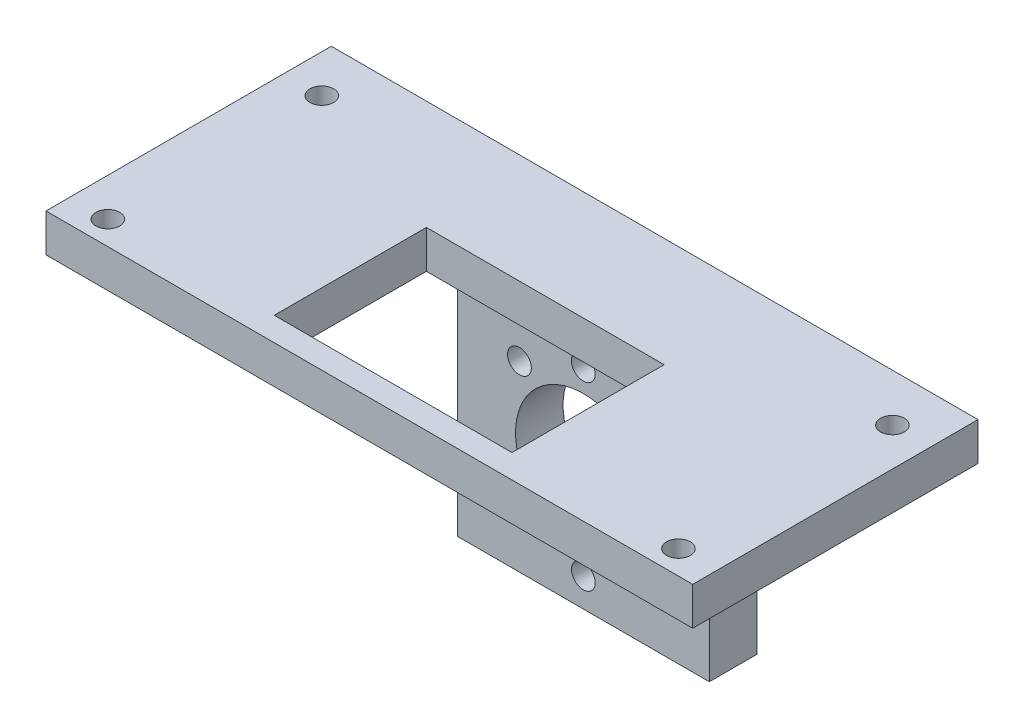
ISO-10303-21;
HEADER;
FILE_DESCRIPTION(('STEP AP214'),'2;1');
FILE_NAME('part.step','',(''),(''),'','','');
FILE_SCHEMA(('AUTOMOTIVE_DESIGN { 1 0 10303 214 1 1 1 1 }'));
ENDSEC;
DATA;
#1=APPLICATION_CONTEXT('core data for automotive mechanical design processes');
#2=APPLICATION_PROTOCOL_DEFINITION('international standard','automotive_design',2000,#1);
#3=PRODUCT_CONTEXT('',#1,'mechanical');
#4=PRODUCT('Part','Part','',(#3));
#5=PRODUCT_RELATED_PRODUCT_CATEGORY('part','',(#4));
#6=PRODUCT_DEFINITION_FORMATION('','',#4);
#7=PRODUCT_DEFINITION_CONTEXT('part definition',#1,'design');
#8=PRODUCT_DEFINITION('design','',#6,#7);
#9=PRODUCT_DEFINITION_SHAPE('','',#8);
#10=(LENGTH_UNIT() NAMED_UNIT(*) SI_UNIT(.MILLI.,.METRE.));
#11=(NAMED_UNIT(*) PLANE_ANGLE_UNIT() SI_UNIT($,.RADIAN.));
#12=(NAMED_UNIT(*) SI_UNIT($,.STERADIAN.) SOLID_ANGLE_UNIT());
#13=UNCERTAINTY_MEASURE_WITH_UNIT(LENGTH_MEASURE(1.E-05),#10,'distance_accuracy_value','');
#14=(GEOMETRIC_REPRESENTATION_CONTEXT(3) GLOBAL_UNCERTAINTY_ASSIGNED_CONTEXT((#13)) GLOBAL_UNIT_ASSIGNED_CONTEXT((#10,
#11,#12)) REPRESENTATION_CONTEXT('',''));
#15=CARTESIAN_POINT('',(0.,0.,0.));
#16=DIRECTION('',(0.,0.,1.));
#17=DIRECTION('',(1.,0.,0.));
#18=AXIS2_PLACEMENT_3D('',#15,#16,#17);
#19=CARTESIAN_POINT('',(54.564971157456,11.564971157456,5.));
#20=DIRECTION('',(0.,0.,1.));
#21=DIRECTION('',(1.,0.,0.));
#22=AXIS2_PLACEMENT_3D('',#19,#20,#21);
#23=CYLINDRICAL_SURFACE('',#22,2.5);
#24=CARTESIAN_POINT('',(54.564971157456,11.564971157456,5.));
#25=DIRECTION('',(0.,0.,1.));
#26=DIRECTION('',(1.,0.,0.));
#27=AXIS2_PLACEMENT_3D('',#24,#25,#26);
#28=CIRCLE('',#27,2.5);
#29=CARTESIAN_POINT('',(57.064971157456,11.564971157456,5.));
#30=VERTEX_POINT('',#29);
#31=EDGE_CURVE('E175',#30,#30,#28,.F.);
#32=ORIENTED_EDGE('',*,*,#31,.T.);
#33=EDGE_LOOP('',(#32));
#34=FACE_BOUND('',#33,.T.);
#35=CARTESIAN_POINT('',(54.564971157456,11.564971157456,15.));
#36=DIRECTION('',(0.,0.,1.));
#37=DIRECTION('',(1.,0.,0.));
#38=AXIS2_PLACEMENT_3D('',#35,#36,#37);
#39=CIRCLE('',#38,2.5);
#40=CARTESIAN_POINT('',(57.064971157456,11.564971157456,15.));
#41=VERTEX_POINT('',#40);
#42=EDGE_CURVE('E19',#41,#41,#39,.F.);
#43=ORIENTED_EDGE('',*,*,#42,.F.);
#44=EDGE_LOOP('',(#43));
#45=FACE_BOUND('',#44,.T.);
#46=ADVANCED_FACE('F16',(#34,#45),#23,.F.);
#47=CARTESIAN_POINT('',(68.,6.,5.));
#48=DIRECTION('',(0.,0.,1.));
#49=DIRECTION('',(1.,0.,0.));
#50=AXIS2_PLACEMENT_3D('',#47,#48,#49);
#51=CYLINDRICAL_SURFACE('',#50,2.5);
#52=CARTESIAN_POINT('',(68.,6.,5.));
#53=DIRECTION('',(0.,0.,1.));
#54=DIRECTION('',(1.,0.,0.));
#55=AXIS2_PLACEMENT_3D('',#52,#53,#54);
#56=CIRCLE('',#55,2.5);
#57=CARTESIAN_POINT('',(70.5,6.,5.));
#58=VERTEX_POINT('',#57);
#59=EDGE_CURVE('E229',#58,#58,#56,.F.);
#60=ORIENTED_EDGE('',*,*,#59,.T.);
#61=EDGE_LOOP('',(#60));
#62=FACE_BOUND('',#61,.T.);
#63=CARTESIAN_POINT('',(68.,6.,15.));
#64=DIRECTION('',(0.,0.,1.));
#65=DIRECTION('',(1.,0.,0.));
#66=AXIS2_PLACEMENT_3D('',#63,#64,#65);
#67=CIRCLE('',#66,2.5);
#68=CARTESIAN_POINT('',(70.5,6.,15.));
#69=VERTEX_POINT('',#68);
#70=EDGE_CURVE('E247',#69,#69,#67,.F.);
#71=ORIENTED_EDGE('',*,*,#70,.F.);
#72=EDGE_LOOP('',(#71));
#73=FACE_BOUND('',#72,.T.);
#74=ADVANCED_FACE('F258',(#62,#73),#51,.F.);
#75=CARTESIAN_POINT('',(81.435028842544,11.564971157456,5.));
#76=DIRECTION('',(0.,0.,1.));
#77=DIRECTION('',(1.,0.,0.));
#78=AXIS2_PLACEMENT_3D('',#75,#76,#77);
#79=CYLINDRICAL_SURFACE('',#78,2.5);
#80=CARTESIAN_POINT('',(81.435028842544,11.564971157456,5.));
#81=DIRECTION('',(0.,0.,1.));
#82=DIRECTION('',(1.,0.,0.));
#83=AXIS2_PLACEMENT_3D('',#80,#81,#82);
#84=CIRCLE('',#83,2.5);
#85=CARTESIAN_POINT('',(83.935028842544,11.564971157456,5.));
#86=VERTEX_POINT('',#85);
#87=EDGE_CURVE('E226',#86,#86,#84,.F.);
#88=ORIENTED_EDGE('',*,*,#87,.T.);
#89=EDGE_LOOP('',(#88));
#90=FACE_BOUND('',#89,.T.);
#91=CARTESIAN_POINT('',(81.435028842544,11.564971157456,15.));
#92=DIRECTION('',(0.,0.,1.));
#93=DIRECTION('',(1.,0.,0.));
#94=AXIS2_PLACEMENT_3D('',#91,#92,#93);
#95=CIRCLE('',#94,2.5);
#96=CARTESIAN_POINT('',(83.935028842544,11.564971157456,15.));
#97=VERTEX_POINT('',#96);
#98=EDGE_CURVE('E245',#97,#97,#95,.F.);
#99=ORIENTED_EDGE('',*,*,#98,.F.);
#100=EDGE_LOOP('',(#99));
#101=FACE_BOUND('',#100,.T.);
#102=ADVANCED_FACE('F264',(#90,#101),#79,.F.);
#103=CARTESIAN_POINT('',(68.,25.,5.));
#104=DIRECTION('',(0.,0.,1.));
#105=DIRECTION('',(1.,0.,0.));
#106=AXIS2_PLACEMENT_3D('',#103,#104,#105);
#107=CYLINDRICAL_SURFACE('',#106,14.25);
#108=CARTESIAN_POINT('',(68.,25.,5.));
#109=DIRECTION('',(0.,0.,1.));
#110=DIRECTION('',(1.,0.,0.));
#111=AXIS2_PLACEMENT_3D('',#108,#109,#110);
#112=CIRCLE('',#111,14.25);
#113=CARTESIAN_POINT('',(82.25,25.,5.));
#114=VERTEX_POINT('',#113);
#115=EDGE_CURVE('E223',#114,#114,#112,.F.);
#116=ORIENTED_EDGE('',*,*,#115,.T.);
#117=EDGE_LOOP('',(#116));
#118=FACE_BOUND('',#117,.T.);
#119=CARTESIAN_POINT('',(68.,25.,15.));
#120=DIRECTION('',(0.,0.,1.));
#121=DIRECTION('',(1.,0.,0.));
#122=AXIS2_PLACEMENT_3D('',#119,#120,#121);
#123=CIRCLE('',#122,14.25);
#124=CARTESIAN_POINT('',(82.25,25.,15.));
#125=VERTEX_POINT('',#124);
#126=EDGE_CURVE('E242',#125,#125,#123,.F.);
#127=ORIENTED_EDGE('',*,*,#126,.F.);
#128=EDGE_LOOP('',(#127));
#129=FACE_BOUND('',#128,.T.);
#130=ADVANCED_FACE('F354',(#118,#129),#107,.F.);
#131=CARTESIAN_POINT('',(54.564971157456,38.435028842544,5.));
#132=DIRECTION('',(0.,0.,1.));
#133=DIRECTION('',(1.,0.,0.));
#134=AXIS2_PLACEMENT_3D('',#131,#132,#133);
#135=CYLINDRICAL_SURFACE('',#134,2.5);
#136=CARTESIAN_POINT('',(54.564971157456,38.435028842544,5.));
#137=DIRECTION('',(0.,0.,1.));
#138=DIRECTION('',(1.,0.,0.));
#139=AXIS2_PLACEMENT_3D('',#136,#137,#138);
#140=CIRCLE('',#139,2.5);
#141=CARTESIAN_POINT('',(57.064971157456,38.435028842544,5.));
#142=VERTEX_POINT('',#141);
#143=EDGE_CURVE('E220',#142,#142,#140,.F.);
#144=ORIENTED_EDGE('',*,*,#143,.T.);
#145=EDGE_LOOP('',(#144));
#146=FACE_BOUND('',#145,.T.);
#147=CARTESIAN_POINT('',(54.564971157456,38.435028842544,15.));
#148=DIRECTION('',(0.,0.,1.));
#149=DIRECTION('',(1.,0.,0.));
#150=AXIS2_PLACEMENT_3D('',#147,#148,#149);
#151=CIRCLE('',#150,2.5);
#152=CARTESIAN_POINT('',(57.064971157456,38.435028842544,15.));
#153=VERTEX_POINT('',#152);
#154=EDGE_CURVE('E239',#153,#153,#151,.F.);
#155=ORIENTED_EDGE('',*,*,#154,.F.);
#156=EDGE_LOOP('',(#155));
#157=FACE_BOUND('',#156,.T.);
#158=ADVANCED_FACE('F350',(#146,#157),#135,.F.);
#159=CARTESIAN_POINT('',(68.,44.,5.));
#160=DIRECTION('',(0.,0.,1.));
#161=DIRECTION('',(1.,0.,0.));
#162=AXIS2_PLACEMENT_3D('',#159,#160,#161);
#163=CYLINDRICAL_SURFACE('',#162,2.5);
#164=CARTESIAN_POINT('',(68.,44.,5.));
#165=DIRECTION('',(0.,0.,1.));
#166=DIRECTION('',(1.,0.,0.));
#167=AXIS2_PLACEMENT_3D('',#164,#165,#166);
#168=CIRCLE('',#167,2.5);
#169=CARTESIAN_POINT('',(70.5,44.,5.));
#170=VERTEX_POINT('',#169);
#171=EDGE_CURVE('E217',#170,#170,#168,.F.);
#172=ORIENTED_EDGE('',*,*,#171,.T.);
#173=EDGE_LOOP('',(#172));
#174=FACE_BOUND('',#173,.T.);
#175=CARTESIAN_POINT('',(68.,44.,15.));
#176=DIRECTION('',(0.,0.,1.));
#177=DIRECTION('',(1.,0.,0.));
#178=AXIS2_PLACEMENT_3D('',#175,#176,#177);
#179=CIRCLE('',#178,2.5);
#180=CARTESIAN_POINT('',(70.5,44.,15.));
#181=VERTEX_POINT('',#180);
#182=EDGE_CURVE('E236',#181,#181,#179,.F.);
#183=ORIENTED_EDGE('',*,*,#182,.F.);
#184=EDGE_LOOP('',(#183));
#185=FACE_BOUND('',#184,.T.);
#186=ADVANCED_FACE('F346',(#174,#185),#163,.F.);
#187=CARTESIAN_POINT('',(81.435028842544,38.435028842544,5.));
#188=DIRECTION('',(0.,0.,1.));
#189=DIRECTION('',(1.,0.,0.));
#190=AXIS2_PLACEMENT_3D('',#187,#188,#189);
#191=CYLINDRICAL_SURFACE('',#190,2.5);
#192=CARTESIAN_POINT('',(81.435028842544,38.435028842544,5.));
#193=DIRECTION('',(0.,0.,1.));
#194=DIRECTION('',(1.,0.,0.));
#195=AXIS2_PLACEMENT_3D('',#192,#193,#194);
#196=CIRCLE('',#195,2.5);
#197=CARTESIAN_POINT('',(83.935028842544,38.435028842544,5.));
#198=VERTEX_POINT('',#197);
#199=EDGE_CURVE('E171',#198,#198,#196,.F.);
#200=ORIENTED_EDGE('',*,*,#199,.T.);
#201=EDGE_LOOP('',(#200));
#202=FACE_BOUND('',#201,.T.);
#203=CARTESIAN_POINT('',(81.435028842544,38.435028842544,15.));
#204=DIRECTION('',(0.,0.,1.));
#205=DIRECTION('',(1.,0.,0.));
#206=AXIS2_PLACEMENT_3D('',#203,#204,#205);
#207=CIRCLE('',#206,2.5);
#208=CARTESIAN_POINT('',(83.935028842544,38.435028842544,15.));
#209=VERTEX_POINT('',#208);
#210=EDGE_CURVE('E180',#209,#209,#207,.F.);
#211=ORIENTED_EDGE('',*,*,#210,.F.);
#212=EDGE_LOOP('',(#211));
#213=FACE_BOUND('',#212,.T.);
#214=ADVANCED_FACE('F342',(#202,#213),#191,.F.);
#215=CARTESIAN_POINT('',(41.5,0.,5.));
#216=DIRECTION('',(0.,1.,0.));
#217=DIRECTION('',(0.,0.,1.));
#218=AXIS2_PLACEMENT_3D('',#215,#216,#217);
#219=PLANE('',#218);
#220=DIRECTION('',(1.,0.,0.));
#221=VECTOR('',#220,1.);
#222=CARTESIAN_POINT('',(41.5,0.,15.));
#223=LINE('',#222,#221);
#224=CARTESIAN_POINT('',(41.5,0.,15.));
#225=VERTEX_POINT('',#224);
#226=CARTESIAN_POINT('',(94.5,0.,15.));
#227=VERTEX_POINT('',#226);
#228=EDGE_CURVE('E165',#225,#227,#223,.T.);
#229=ORIENTED_EDGE('',*,*,#228,.F.);
#230=DIRECTION('',(0.,0.,-1.));
#231=VECTOR('',#230,1.);
#232=CARTESIAN_POINT('',(41.5,0.,5.));
#233=LINE('',#232,#231);
#234=CARTESIAN_POINT('',(41.5,0.,5.));
#235=VERTEX_POINT('',#234);
#236=EDGE_CURVE('E178',#225,#235,#233,.T.);
#237=ORIENTED_EDGE('',*,*,#236,.T.);
#238=DIRECTION('',(1.,0.,0.));
#239=VECTOR('',#238,1.);
#240=CARTESIAN_POINT('',(41.5,0.,5.));
#241=LINE('',#240,#239);
#242=CARTESIAN_POINT('',(94.5,0.,5.));
#243=VERTEX_POINT('',#242);
#244=EDGE_CURVE('E153',#235,#243,#241,.T.);
#245=ORIENTED_EDGE('',*,*,#244,.T.);
#246=DIRECTION('',(0.,0.,-1.));
#247=VECTOR('',#246,1.);
#248=CARTESIAN_POINT('',(94.5,0.,5.));
#249=LINE('',#248,#247);
#250=EDGE_CURVE('E144',#227,#243,#249,.T.);
#251=ORIENTED_EDGE('',*,*,#250,.F.);
#252=EDGE_LOOP('',(#229,#237,#245,#251));
#253=FACE_BOUND('',#252,.T.);
#254=ADVANCED_FACE('F338',(#253),#219,.F.);
#255=CARTESIAN_POINT('',(41.5,0.,15.));
#256=DIRECTION('',(0.,0.,1.));
#257=DIRECTION('',(1.,0.,0.));
#258=AXIS2_PLACEMENT_3D('',#255,#256,#257);
#259=PLANE('',#258);
#260=ORIENTED_EDGE('',*,*,#210,.T.);
#261=EDGE_LOOP('',(#260));
#262=FACE_BOUND('',#261,.T.);
#263=ORIENTED_EDGE('',*,*,#182,.T.);
#264=EDGE_LOOP('',(#263));
#265=FACE_BOUND('',#264,.T.);
#266=ORIENTED_EDGE('',*,*,#154,.T.);
#267=EDGE_LOOP('',(#266));
#268=FACE_BOUND('',#267,.T.);
#269=ORIENTED_EDGE('',*,*,#126,.T.);
#270=EDGE_LOOP('',(#269));
#271=FACE_BOUND('',#270,.T.);
#272=ORIENTED_EDGE('',*,*,#98,.T.);
#273=EDGE_LOOP('',(#272));
#274=FACE_BOUND('',#273,.T.);
#275=ORIENTED_EDGE('',*,*,#70,.T.);
#276=EDGE_LOOP('',(#275));
#277=FACE_BOUND('',#276,.T.);
#278=ORIENTED_EDGE('',*,*,#42,.T.);
#279=EDGE_LOOP('',(#278));
#280=FACE_BOUND('',#279,.T.);
#281=DIRECTION('',(0.,1.,0.));
#282=VECTOR('',#281,1.);
#283=CARTESIAN_POINT('',(94.5,0.,15.));
#284=LINE('',#283,#282);
#285=CARTESIAN_POINT('',(94.5,50.,15.));
#286=VERTEX_POINT('',#285);
#287=EDGE_CURVE('E130',#286,#227,#284,.F.);
#288=ORIENTED_EDGE('',*,*,#287,.F.);
#289=DIRECTION('',(1.,0.,0.));
#290=VECTOR('',#289,1.);
#291=CARTESIAN_POINT('',(41.5,50.,15.));
#292=LINE('',#291,#290);
#293=CARTESIAN_POINT('',(41.5,50.,15.));
#294=VERTEX_POINT('',#293);
#295=EDGE_CURVE('E129',#286,#294,#292,.F.);
#296=ORIENTED_EDGE('',*,*,#295,.T.);
#297=DIRECTION('',(0.,1.,0.));
#298=VECTOR('',#297,1.);
#299=CARTESIAN_POINT('',(41.5,0.,15.));
#300=LINE('',#299,#298);
#301=EDGE_CURVE('E154',#294,#225,#300,.F.);
#302=ORIENTED_EDGE('',*,*,#301,.T.);
#303=ORIENTED_EDGE('',*,*,#228,.T.);
#304=EDGE_LOOP('',(#288,#296,#302,#303));
#305=FACE_BOUND('',#304,.T.);
#306=ADVANCED_FACE('F254',(#262,#265,#268,#271,#274,#277,#280,#305),#259,.T.);
#307=CARTESIAN_POINT('',(41.5,0.,5.));
#308=DIRECTION('',(1.,0.,0.));
#309=DIRECTION('',(0.,0.,-1.));
#310=AXIS2_PLACEMENT_3D('',#307,#308,#309);
#311=PLANE('',#310);
#312=ORIENTED_EDGE('',*,*,#301,.F.);
#313=CARTESIAN_POINT('',(41.5,50.,18.));
#314=DIRECTION('',(1.,0.,0.));
#315=DIRECTION('',(0.,0.,-1.));
#316=AXIS2_PLACEMENT_3D('',#313,#314,#315);
#317=CIRCLE('',#316,3.);
#318=CARTESIAN_POINT('',(41.5,53.,18.));
#319=VERTEX_POINT('',#318);
#320=EDGE_CURVE('E158',#294,#319,#317,.T.);
#321=ORIENTED_EDGE('',*,*,#320,.T.);
#322=DIRECTION('',(0.,0.,1.));
#323=VECTOR('',#322,1.);
#324=CARTESIAN_POINT('',(41.5,53.,0.));
#325=LINE('',#324,#323);
#326=CARTESIAN_POINT('',(41.5,53.,5.));
#327=VERTEX_POINT('',#326);
#328=EDGE_CURVE('E134',#319,#327,#325,.F.);
#329=ORIENTED_EDGE('',*,*,#328,.T.);
#330=DIRECTION('',(0.,1.,0.));
#331=VECTOR('',#330,1.);
#332=CARTESIAN_POINT('',(41.5,0.,5.));
#333=LINE('',#332,#331);
#334=EDGE_CURVE('E150',#327,#235,#333,.F.);
#335=ORIENTED_EDGE('',*,*,#334,.T.);
#336=ORIENTED_EDGE('',*,*,#236,.F.);
#337=EDGE_LOOP('',(#312,#321,#329,#335,#336));
#338=FACE_BOUND('',#337,.T.);
#339=ADVANCED_FACE('F331',(#338),#311,.F.);
#340=CARTESIAN_POINT('',(41.5,0.,5.));
#341=DIRECTION('',(0.,0.,1.));
#342=DIRECTION('',(1.,0.,0.));
#343=AXIS2_PLACEMENT_3D('',#340,#341,#342);
#344=PLANE('',#343);
#345=ORIENTED_EDGE('',*,*,#199,.F.);
#346=EDGE_LOOP('',(#345));
#347=FACE_BOUND('',#346,.T.);
#348=ORIENTED_EDGE('',*,*,#171,.F.);
#349=EDGE_LOOP('',(#348));
#350=FACE_BOUND('',#349,.T.);
#351=ORIENTED_EDGE('',*,*,#143,.F.);
#352=EDGE_LOOP('',(#351));
#353=FACE_BOUND('',#352,.T.);
#354=ORIENTED_EDGE('',*,*,#115,.F.);
#355=EDGE_LOOP('',(#354));
#356=FACE_BOUND('',#355,.T.);
#357=ORIENTED_EDGE('',*,*,#87,.F.);
#358=EDGE_LOOP('',(#357));
#359=FACE_BOUND('',#358,.T.);
#360=ORIENTED_EDGE('',*,*,#59,.F.);
#361=EDGE_LOOP('',(#360));
#362=FACE_BOUND('',#361,.T.);
#363=ORIENTED_EDGE('',*,*,#31,.F.);
#364=EDGE_LOOP('',(#363));
#365=FACE_BOUND('',#364,.T.);
#366=DIRECTION('',(0.,1.,0.));
#367=VECTOR('',#366,1.);
#368=CARTESIAN_POINT('',(94.5,0.,5.));
#369=LINE('',#368,#367);
#370=CARTESIAN_POINT('',(94.5,53.,5.));
#371=VERTEX_POINT('',#370);
#372=EDGE_CURVE('E117',#243,#371,#369,.T.);
#373=ORIENTED_EDGE('',*,*,#372,.F.);
#374=ORIENTED_EDGE('',*,*,#244,.F.);
#375=ORIENTED_EDGE('',*,*,#334,.F.);
#376=DIRECTION('',(1.,0.,0.));
#377=VECTOR('',#376,1.);
#378=CARTESIAN_POINT('',(0.,53.,5.));
#379=LINE('',#378,#377);
#380=EDGE_CURVE('E123',#327,#371,#379,.T.);
#381=ORIENTED_EDGE('',*,*,#380,.T.);
#382=EDGE_LOOP('',(#373,#374,#375,#381));
#383=FACE_BOUND('',#382,.T.);
#384=ADVANCED_FACE('F328',(#347,#350,#353,#356,#359,#362,#365,#383),#344,.F.);
#385=CARTESIAN_POINT('',(94.5,50.,15.));
#386=DIRECTION('',(1.,0.,0.));
#387=DIRECTION('',(0.,0.,-1.));
#388=AXIS2_PLACEMENT_3D('',#385,#386,#387);
#389=PLANE('',#388);
#390=CARTESIAN_POINT('',(94.5,50.,18.));
#391=DIRECTION('',(1.,0.,0.));
#392=DIRECTION('',(0.,0.,-1.));
#393=AXIS2_PLACEMENT_3D('',#390,#391,#392);
#394=CIRCLE('',#393,3.);
#395=CARTESIAN_POINT('',(94.5,53.,18.));
#396=VERTEX_POINT('',#395);
#397=EDGE_CURVE('E113',#396,#286,#394,.F.);
#398=ORIENTED_EDGE('',*,*,#397,.T.);
#399=ORIENTED_EDGE('',*,*,#287,.T.);
#400=ORIENTED_EDGE('',*,*,#250,.T.);
#401=ORIENTED_EDGE('',*,*,#372,.T.);
#402=DIRECTION('',(0.,0.,1.));
#403=VECTOR('',#402,1.);
#404=CARTESIAN_POINT('',(94.5,53.,0.));
#405=LINE('',#404,#403);
#406=EDGE_CURVE('E109',#371,#396,#405,.T.);
#407=ORIENTED_EDGE('',*,*,#406,.T.);
#408=EDGE_LOOP('',(#398,#399,#400,#401,#407));
#409=FACE_BOUND('',#408,.T.);
#410=ADVANCED_FACE('F111',(#409),#389,.T.);
#411=CARTESIAN_POINT('',(41.5,50.,18.));
#412=DIRECTION('',(1.,0.,0.));
#413=DIRECTION('',(0.,0.,-1.));
#414=AXIS2_PLACEMENT_3D('',#411,#412,#413);
#415=CYLINDRICAL_SURFACE('',#414,3.);
#416=ORIENTED_EDGE('',*,*,#320,.F.);
#417=ORIENTED_EDGE('',*,*,#295,.F.);
#418=ORIENTED_EDGE('',*,*,#397,.F.);
#419=DIRECTION('',(1.,0.,0.));
#420=VECTOR('',#419,1.);
#421=CARTESIAN_POINT('',(0.,53.,18.));
#422=LINE('',#421,#420);
#423=EDGE_CURVE('E122',#396,#319,#422,.F.);
#424=ORIENTED_EDGE('',*,*,#423,.T.);
#425=EDGE_LOOP('',(#416,#417,#418,#424));
#426=FACE_BOUND('',#425,.T.);
#427=ADVANCED_FACE('F127',(#426),#415,.F.);
#428=CARTESIAN_POINT('',(0.,53.,0.));
#429=DIRECTION('',(0.,1.,0.));
#430=DIRECTION('',(0.,0.,1.));
#431=AXIS2_PLACEMENT_3D('',#428,#429,#430);
#432=PLANE('',#431);
#433=CARTESIAN_POINT('',(128.,53.,55.));
#434=DIRECTION('',(0.,1.,0.));
#435=DIRECTION('',(0.,0.,1.));
#436=AXIS2_PLACEMENT_3D('',#433,#434,#435);
#437=CIRCLE('',#436,2.5);
#438=CARTESIAN_POINT('',(128.,53.,57.5));
#439=VERTEX_POINT('',#438);
#440=EDGE_CURVE('E198',#439,#439,#437,.T.);
#441=ORIENTED_EDGE('',*,*,#440,.T.);
#442=EDGE_LOOP('',(#441));
#443=FACE_BOUND('',#442,.T.);
#444=DIRECTION('',(1.,0.,0.));
#445=VECTOR('',#444,1.);
#446=CARTESIAN_POINT('',(43.,53.,23.));
#447=LINE('',#446,#445);
#448=CARTESIAN_POINT('',(43.,53.,23.));
#449=VERTEX_POINT('',#448);
#450=CARTESIAN_POINT('',(93.,53.,23.));
#451=VERTEX_POINT('',#450);
#452=EDGE_CURVE('E564',#449,#451,#447,.T.);
#453=ORIENTED_EDGE('',*,*,#452,.F.);
#454=DIRECTION('',(0.,0.,-1.));
#455=VECTOR('',#454,1.);
#456=CARTESIAN_POINT('',(43.,53.,23.));
#457=LINE('',#456,#455);
#458=CARTESIAN_POINT('',(43.,53.,55.));
#459=VERTEX_POINT('',#458);
#460=EDGE_CURVE('E602',#459,#449,#457,.T.);
#461=ORIENTED_EDGE('',*,*,#460,.F.);
#462=DIRECTION('',(1.,0.,0.));
#463=VECTOR('',#462,1.);
#464=CARTESIAN_POINT('',(43.,53.,55.));
#465=LINE('',#464,#463);
#466=CARTESIAN_POINT('',(93.,53.,55.));
#467=VERTEX_POINT('',#466);
#468=EDGE_CURVE('E206',#459,#467,#465,.T.);
#469=ORIENTED_EDGE('',*,*,#468,.T.);
#470=DIRECTION('',(0.,0.,-1.));
#471=VECTOR('',#470,1.);
#472=CARTESIAN_POINT('',(93.,53.,23.));
#473=LINE('',#472,#471);
#474=EDGE_CURVE('E594',#467,#451,#473,.T.);
#475=ORIENTED_EDGE('',*,*,#474,.T.);
#476=EDGE_LOOP('',(#453,#461,#469,#475));
#477=FACE_BOUND('',#476,.T.);
#478=CARTESIAN_POINT('',(128.,53.,10.));
#479=DIRECTION('',(0.,1.,0.));
#480=DIRECTION('',(0.,0.,1.));
#481=AXIS2_PLACEMENT_3D('',#478,#479,#480);
#482=CIRCLE('',#481,2.5);
#483=CARTESIAN_POINT('',(128.,53.,12.5));
#484=VERTEX_POINT('',#483);
#485=EDGE_CURVE('E203',#484,#484,#482,.T.);
#486=ORIENTED_EDGE('',*,*,#485,.T.);
#487=EDGE_LOOP('',(#486));
#488=FACE_BOUND('',#487,.T.);
#489=ORIENTED_EDGE('',*,*,#406,.F.);
#490=ORIENTED_EDGE('',*,*,#380,.F.);
#491=ORIENTED_EDGE('',*,*,#328,.F.);
#492=ORIENTED_EDGE('',*,*,#423,.F.);
#493=EDGE_LOOP('',(#489,#490,#491,#492));
#494=FACE_BOUND('',#493,.T.);
#495=CARTESIAN_POINT('',(8.,53.,55.));
#496=DIRECTION('',(0.,1.,0.));
#497=DIRECTION('',(0.,0.,1.));
#498=AXIS2_PLACEMENT_3D('',#495,#496,#497);
#499=CIRCLE('',#498,2.5);
#500=CARTESIAN_POINT('',(8.,53.,57.5));
#501=VERTEX_POINT('',#500);
#502=EDGE_CURVE('E207',#501,#501,#499,.T.);
#503=ORIENTED_EDGE('',*,*,#502,.T.);
#504=EDGE_LOOP('',(#503));
#505=FACE_BOUND('',#504,.T.);
#506=CARTESIAN_POINT('',(8.,53.,10.));
#507=DIRECTION('',(0.,1.,0.));
#508=DIRECTION('',(0.,0.,1.));
#509=AXIS2_PLACEMENT_3D('',#506,#507,#508);
#510=CIRCLE('',#509,2.5);
#511=CARTESIAN_POINT('',(8.,53.,12.5));
#512=VERTEX_POINT('',#511);
#513=EDGE_CURVE('E210',#512,#512,#510,.T.);
#514=ORIENTED_EDGE('',*,*,#513,.T.);
#515=EDGE_LOOP('',(#514));
#516=FACE_BOUND('',#515,.T.);
#517=DIRECTION('',(1.,0.,0.));
#518=VECTOR('',#517,1.);
#519=CARTESIAN_POINT('',(0.,53.,60.));
#520=LINE('',#519,#518);
#521=CARTESIAN_POINT('',(0.,53.,60.));
#522=VERTEX_POINT('',#521);
#523=CARTESIAN_POINT('',(136.,53.,60.));
#524=VERTEX_POINT('',#523);
#525=EDGE_CURVE('E613',#522,#524,#520,.T.);
#526=ORIENTED_EDGE('',*,*,#525,.F.);
#527=DIRECTION('',(0.,0.,-1.));
#528=VECTOR('',#527,1.);
#529=CARTESIAN_POINT('',(0.,53.,0.));
#530=LINE('',#529,#528);
#531=CARTESIAN_POINT('',(0.,53.,0.));
#532=VERTEX_POINT('',#531);
#533=EDGE_CURVE('E138',#522,#532,#530,.T.);
#534=ORIENTED_EDGE('',*,*,#533,.T.);
#535=DIRECTION('',(1.,0.,0.));
#536=VECTOR('',#535,1.);
#537=CARTESIAN_POINT('',(0.,53.,0.));
#538=LINE('',#537,#536);
#539=CARTESIAN_POINT('',(136.,53.,0.));
#540=VERTEX_POINT('',#539);
#541=EDGE_CURVE('E136',#532,#540,#538,.T.);
#542=ORIENTED_EDGE('',*,*,#541,.T.);
#543=DIRECTION('',(0.,0.,-1.));
#544=VECTOR('',#543,1.);
#545=CARTESIAN_POINT('',(136.,53.,0.));
#546=LINE('',#545,#544);
#547=EDGE_CURVE('E610',#524,#540,#546,.T.);
#548=ORIENTED_EDGE('',*,*,#547,.F.);
#549=EDGE_LOOP('',(#526,#534,#542,#548));
#550=FACE_BOUND('',#549,.T.);
#551=ADVANCED_FACE('F132',(#443,#477,#488,#494,#505,#516,#550),#432,.F.);
#552=CARTESIAN_POINT('',(0.,53.,0.));
#553=DIRECTION('',(0.,0.,1.));
#554=DIRECTION('',(1.,0.,0.));
#555=AXIS2_PLACEMENT_3D('',#552,#553,#554);
#556=PLANE('',#555);
#557=DIRECTION('',(0.,1.,0.));
#558=VECTOR('',#557,1.);
#559=CARTESIAN_POINT('',(136.,53.,0.));
#560=LINE('',#559,#558);
#561=CARTESIAN_POINT('',(136.,61.,0.));
#562=VERTEX_POINT('',#561);
#563=EDGE_CURVE('E607',#540,#562,#560,.T.);
#564=ORIENTED_EDGE('',*,*,#563,.F.);
#565=ORIENTED_EDGE('',*,*,#541,.F.);
#566=DIRECTION('',(0.,1.,0.));
#567=VECTOR('',#566,1.);
#568=CARTESIAN_POINT('',(0.,53.,0.));
#569=LINE('',#568,#567);
#570=CARTESIAN_POINT('',(0.,61.,0.));
#571=VERTEX_POINT('',#570);
#572=EDGE_CURVE('E618',#532,#571,#569,.T.);
#573=ORIENTED_EDGE('',*,*,#572,.T.);
#574=DIRECTION('',(1.,0.,0.));
#575=VECTOR('',#574,1.);
#576=CARTESIAN_POINT('',(0.,61.,0.));
#577=LINE('',#576,#575);
#578=EDGE_CURVE('E201',#562,#571,#577,.F.);
#579=ORIENTED_EDGE('',*,*,#578,.F.);
#580=EDGE_LOOP('',(#564,#565,#573,#579));
#581=FACE_BOUND('',#580,.T.);
#582=ADVANCED_FACE('F316',(#581),#556,.F.);
#583=CARTESIAN_POINT('',(0.,53.,0.));
#584=DIRECTION('',(1.,0.,0.));
#585=DIRECTION('',(0.,0.,-1.));
#586=AXIS2_PLACEMENT_3D('',#583,#584,#585);
#587=PLANE('',#586);
#588=DIRECTION('',(0.,0.,1.));
#589=VECTOR('',#588,1.);
#590=CARTESIAN_POINT('',(0.,61.,0.));
#591=LINE('',#590,#589);
#592=CARTESIAN_POINT('',(0.,61.,60.));
#593=VERTEX_POINT('',#592);
#594=EDGE_CURVE('E583',#571,#593,#591,.T.);
#595=ORIENTED_EDGE('',*,*,#594,.F.);
#596=ORIENTED_EDGE('',*,*,#572,.F.);
#597=ORIENTED_EDGE('',*,*,#533,.F.);
#598=DIRECTION('',(0.,1.,0.));
#599=VECTOR('',#598,1.);
#600=CARTESIAN_POINT('',(0.,53.,60.));
#601=LINE('',#600,#599);
#602=EDGE_CURVE('E616',#593,#522,#601,.F.);
#603=ORIENTED_EDGE('',*,*,#602,.F.);
#604=EDGE_LOOP('',(#595,#596,#597,#603));
#605=FACE_BOUND('',#604,.T.);
#606=ADVANCED_FACE('F312',(#605),#587,.F.);
#607=CARTESIAN_POINT('',(0.,53.,60.));
#608=DIRECTION('',(0.,0.,1.));
#609=DIRECTION('',(1.,0.,0.));
#610=AXIS2_PLACEMENT_3D('',#607,#608,#609);
#611=PLANE('',#610);
#612=DIRECTION('',(0.,1.,0.));
#613=VECTOR('',#612,1.);
#614=CARTESIAN_POINT('',(136.,53.,60.));
#615=LINE('',#614,#613);
#616=CARTESIAN_POINT('',(136.,61.,60.));
#617=VERTEX_POINT('',#616);
#618=EDGE_CURVE('E213',#617,#524,#615,.F.);
#619=ORIENTED_EDGE('',*,*,#618,.F.);
#620=DIRECTION('',(1.,0.,0.));
#621=VECTOR('',#620,1.);
#622=CARTESIAN_POINT('',(0.,61.,60.));
#623=LINE('',#622,#621);
#624=EDGE_CURVE('E579',#593,#617,#623,.T.);
#625=ORIENTED_EDGE('',*,*,#624,.F.);
#626=ORIENTED_EDGE('',*,*,#602,.T.);
#627=ORIENTED_EDGE('',*,*,#525,.T.);
#628=EDGE_LOOP('',(#619,#625,#626,#627));
#629=FACE_BOUND('',#628,.T.);
#630=ADVANCED_FACE('F308',(#629),#611,.T.);
#631=CARTESIAN_POINT('',(136.,53.,0.));
#632=DIRECTION('',(1.,0.,0.));
#633=DIRECTION('',(0.,0.,-1.));
#634=AXIS2_PLACEMENT_3D('',#631,#632,#633);
#635=PLANE('',#634);
#636=DIRECTION('',(0.,0.,1.));
#637=VECTOR('',#636,1.);
#638=CARTESIAN_POINT('',(136.,61.,0.));
#639=LINE('',#638,#637);
#640=EDGE_CURVE('E197',#617,#562,#639,.F.);
#641=ORIENTED_EDGE('',*,*,#640,.F.);
#642=ORIENTED_EDGE('',*,*,#618,.T.);
#643=ORIENTED_EDGE('',*,*,#547,.T.);
#644=ORIENTED_EDGE('',*,*,#563,.T.);
#645=EDGE_LOOP('',(#641,#642,#643,#644));
#646=FACE_BOUND('',#645,.T.);
#647=ADVANCED_FACE('F304',(#646),#635,.T.);
#648=CARTESIAN_POINT('',(8.,53.,10.));
#649=DIRECTION('',(0.,1.,0.));
#650=DIRECTION('',(0.,0.,1.));
#651=AXIS2_PLACEMENT_3D('',#648,#649,#650);
#652=CYLINDRICAL_SURFACE('',#651,2.5);
#653=ORIENTED_EDGE('',*,*,#513,.F.);
#654=EDGE_LOOP('',(#653));
#655=FACE_BOUND('',#654,.T.);
#656=CARTESIAN_POINT('',(8.,61.,10.));
#657=DIRECTION('',(0.,1.,0.));
#658=DIRECTION('',(0.,0.,1.));
#659=AXIS2_PLACEMENT_3D('',#656,#657,#658);
#660=CIRCLE('',#659,2.5);
#661=CARTESIAN_POINT('',(8.,61.,12.5));
#662=VERTEX_POINT('',#661);
#663=EDGE_CURVE('E194',#662,#662,#660,.F.);
#664=ORIENTED_EDGE('',*,*,#663,.F.);
#665=EDGE_LOOP('',(#664));
#666=FACE_BOUND('',#665,.T.);
#667=ADVANCED_FACE('F300',(#655,#666),#652,.F.);
#668=CARTESIAN_POINT('',(8.,53.,55.));
#669=DIRECTION('',(0.,1.,0.));
#670=DIRECTION('',(0.,0.,1.));
#671=AXIS2_PLACEMENT_3D('',#668,#669,#670);
#672=CYLINDRICAL_SURFACE('',#671,2.5);
#673=ORIENTED_EDGE('',*,*,#502,.F.);
#674=EDGE_LOOP('',(#673));
#675=FACE_BOUND('',#674,.T.);
#676=CARTESIAN_POINT('',(8.,61.,55.));
#677=DIRECTION('',(0.,1.,0.));
#678=DIRECTION('',(0.,0.,1.));
#679=AXIS2_PLACEMENT_3D('',#676,#677,#678);
#680=CIRCLE('',#679,2.5);
#681=CARTESIAN_POINT('',(8.,61.,57.5));
#682=VERTEX_POINT('',#681);
#683=EDGE_CURVE('E191',#682,#682,#680,.F.);
#684=ORIENTED_EDGE('',*,*,#683,.F.);
#685=EDGE_LOOP('',(#684));
#686=FACE_BOUND('',#685,.T.);
#687=ADVANCED_FACE('F296',(#675,#686),#672,.F.);
#688=CARTESIAN_POINT('',(128.,53.,10.));
#689=DIRECTION('',(0.,1.,0.));
#690=DIRECTION('',(0.,0.,1.));
#691=AXIS2_PLACEMENT_3D('',#688,#689,#690);
#692=CYLINDRICAL_SURFACE('',#691,2.5);
#693=ORIENTED_EDGE('',*,*,#485,.F.);
#694=EDGE_LOOP('',(#693));
#695=FACE_BOUND('',#694,.T.);
#696=CARTESIAN_POINT('',(128.,61.,10.));
#697=DIRECTION('',(0.,1.,0.));
#698=DIRECTION('',(0.,0.,1.));
#699=AXIS2_PLACEMENT_3D('',#696,#697,#698);
#700=CIRCLE('',#699,2.5);
#701=CARTESIAN_POINT('',(128.,61.,12.5));
#702=VERTEX_POINT('',#701);
#703=EDGE_CURVE('E187',#702,#702,#700,.F.);
#704=ORIENTED_EDGE('',*,*,#703,.F.);
#705=EDGE_LOOP('',(#704));
#706=FACE_BOUND('',#705,.T.);
#707=ADVANCED_FACE('F292',(#695,#706),#692,.F.);
#708=CARTESIAN_POINT('',(43.,53.,55.));
#709=DIRECTION('',(0.,0.,1.));
#710=DIRECTION('',(1.,0.,0.));
#711=AXIS2_PLACEMENT_3D('',#708,#709,#710);
#712=PLANE('',#711);
#713=DIRECTION('',(0.,1.,0.));
#714=VECTOR('',#713,1.);
#715=CARTESIAN_POINT('',(93.,53.,55.));
#716=LINE('',#715,#714);
#717=CARTESIAN_POINT('',(93.,61.,55.));
#718=VERTEX_POINT('',#717);
#719=EDGE_CURVE('E202',#718,#467,#716,.F.);
#720=ORIENTED_EDGE('',*,*,#719,.T.);
#721=ORIENTED_EDGE('',*,*,#468,.F.);
#722=DIRECTION('',(0.,1.,0.));
#723=VECTOR('',#722,1.);
#724=CARTESIAN_POINT('',(43.,53.,55.));
#725=LINE('',#724,#723);
#726=CARTESIAN_POINT('',(43.,61.,55.));
#727=VERTEX_POINT('',#726);
#728=EDGE_CURVE('E599',#727,#459,#725,.F.);
#729=ORIENTED_EDGE('',*,*,#728,.F.);
#730=DIRECTION('',(1.,0.,0.));
#731=VECTOR('',#730,1.);
#732=CARTESIAN_POINT('',(0.,61.,55.));
#733=LINE('',#732,#731);
#734=EDGE_CURVE('E190',#718,#727,#733,.F.);
#735=ORIENTED_EDGE('',*,*,#734,.F.);
#736=EDGE_LOOP('',(#720,#721,#729,#735));
#737=FACE_BOUND('',#736,.T.);
#738=ADVANCED_FACE('F288',(#737),#712,.F.);
#739=CARTESIAN_POINT('',(43.,53.,23.));
#740=DIRECTION('',(1.,0.,0.));
#741=DIRECTION('',(0.,0.,-1.));
#742=AXIS2_PLACEMENT_3D('',#739,#740,#741);
#743=PLANE('',#742);
#744=DIRECTION('',(0.,0.,1.));
#745=VECTOR('',#744,1.);
#746=CARTESIAN_POINT('',(43.,61.,0.));
#747=LINE('',#746,#745);
#748=CARTESIAN_POINT('',(43.,61.,23.));
#749=VERTEX_POINT('',#748);
#750=EDGE_CURVE('E635',#727,#749,#747,.F.);
#751=ORIENTED_EDGE('',*,*,#750,.F.);
#752=ORIENTED_EDGE('',*,*,#728,.T.);
#753=ORIENTED_EDGE('',*,*,#460,.T.);
#754=DIRECTION('',(0.,1.,0.));
#755=VECTOR('',#754,1.);
#756=CARTESIAN_POINT('',(43.,53.,23.));
#757=LINE('',#756,#755);
#758=EDGE_CURVE('E597',#749,#449,#757,.F.);
#759=ORIENTED_EDGE('',*,*,#758,.F.);
#760=EDGE_LOOP('',(#751,#752,#753,#759));
#761=FACE_BOUND('',#760,.T.);
#762=ADVANCED_FACE('F285',(#761),#743,.T.);
#763=CARTESIAN_POINT('',(43.,53.,23.));
#764=DIRECTION('',(0.,0.,1.));
#765=DIRECTION('',(1.,0.,0.));
#766=AXIS2_PLACEMENT_3D('',#763,#764,#765);
#767=PLANE('',#766);
#768=DIRECTION('',(0.,1.,0.));
#769=VECTOR('',#768,1.);
#770=CARTESIAN_POINT('',(93.,53.,23.));
#771=LINE('',#770,#769);
#772=CARTESIAN_POINT('',(93.,61.,23.));
#773=VERTEX_POINT('',#772);
#774=EDGE_CURVE('E34',#451,#773,#771,.T.);
#775=ORIENTED_EDGE('',*,*,#774,.T.);
#776=DIRECTION('',(1.,0.,0.));
#777=VECTOR('',#776,1.);
#778=CARTESIAN_POINT('',(0.,61.,23.));
#779=LINE('',#778,#777);
#780=EDGE_CURVE('E631',#749,#773,#779,.T.);
#781=ORIENTED_EDGE('',*,*,#780,.F.);
#782=ORIENTED_EDGE('',*,*,#758,.T.);
#783=ORIENTED_EDGE('',*,*,#452,.T.);
#784=EDGE_LOOP('',(#775,#781,#782,#783));
#785=FACE_BOUND('',#784,.T.);
#786=ADVANCED_FACE('F281',(#785),#767,.T.);
#787=CARTESIAN_POINT('',(93.,53.,23.));
#788=DIRECTION('',(1.,0.,0.));
#789=DIRECTION('',(0.,0.,-1.));
#790=AXIS2_PLACEMENT_3D('',#787,#788,#789);
#791=PLANE('',#790);
#792=DIRECTION('',(0.,0.,1.));
#793=VECTOR('',#792,1.);
#794=CARTESIAN_POINT('',(93.,61.,0.));
#795=LINE('',#794,#793);
#796=EDGE_CURVE('E25',#773,#718,#795,.T.);
#797=ORIENTED_EDGE('',*,*,#796,.F.);
#798=ORIENTED_EDGE('',*,*,#774,.F.);
#799=ORIENTED_EDGE('',*,*,#474,.F.);
#800=ORIENTED_EDGE('',*,*,#719,.F.);
#801=EDGE_LOOP('',(#797,#798,#799,#800));
#802=FACE_BOUND('',#801,.T.);
#803=ADVANCED_FACE('F274',(#802),#791,.F.);
#804=CARTESIAN_POINT('',(128.,53.,55.));
#805=DIRECTION('',(0.,1.,0.));
#806=DIRECTION('',(0.,0.,1.));
#807=AXIS2_PLACEMENT_3D('',#804,#805,#806);
#808=CYLINDRICAL_SURFACE('',#807,2.5);
#809=ORIENTED_EDGE('',*,*,#440,.F.);
#810=EDGE_LOOP('',(#809));
#811=FACE_BOUND('',#810,.T.);
#812=CARTESIAN_POINT('',(128.,61.,55.));
#813=DIRECTION('',(0.,1.,0.));
#814=DIRECTION('',(0.,0.,1.));
#815=AXIS2_PLACEMENT_3D('',#812,#813,#814);
#816=CIRCLE('',#815,2.5);
#817=CARTESIAN_POINT('',(128.,61.,57.5));
#818=VERTEX_POINT('',#817);
#819=EDGE_CURVE('E11',#818,#818,#816,.F.);
#820=ORIENTED_EDGE('',*,*,#819,.F.);
#821=EDGE_LOOP('',(#820));
#822=FACE_BOUND('',#821,.T.);
#823=ADVANCED_FACE('F268',(#811,#822),#808,.F.);
#824=CARTESIAN_POINT('',(0.,61.,0.));
#825=DIRECTION('',(0.,1.,0.));
#826=DIRECTION('',(0.,0.,1.));
#827=AXIS2_PLACEMENT_3D('',#824,#825,#826);
#828=PLANE('',#827);
#829=ORIENTED_EDGE('',*,*,#819,.T.);
#830=EDGE_LOOP('',(#829));
#831=FACE_BOUND('',#830,.T.);
#832=ORIENTED_EDGE('',*,*,#780,.T.);
#833=ORIENTED_EDGE('',*,*,#796,.T.);
#834=ORIENTED_EDGE('',*,*,#734,.T.);
#835=ORIENTED_EDGE('',*,*,#750,.T.);
#836=EDGE_LOOP('',(#832,#833,#834,#835));
#837=FACE_BOUND('',#836,.T.);
#838=ORIENTED_EDGE('',*,*,#703,.T.);
#839=EDGE_LOOP('',(#838));
#840=FACE_BOUND('',#839,.T.);
#841=ORIENTED_EDGE('',*,*,#683,.T.);
#842=EDGE_LOOP('',(#841));
#843=FACE_BOUND('',#842,.T.);
#844=ORIENTED_EDGE('',*,*,#663,.T.);
#845=EDGE_LOOP('',(#844));
#846=FACE_BOUND('',#845,.T.);
#847=ORIENTED_EDGE('',*,*,#624,.T.);
#848=ORIENTED_EDGE('',*,*,#640,.T.);
#849=ORIENTED_EDGE('',*,*,#578,.T.);
#850=ORIENTED_EDGE('',*,*,#594,.T.);
#851=EDGE_LOOP('',(#847,#848,#849,#850));
#852=FACE_BOUND('',#851,.T.);
#853=ADVANCED_FACE('F266',(#831,#837,#840,#843,#846,#852),#828,.T.);
#854=CLOSED_SHELL('',(#46,#74,#102,#130,#158,#186,#214,#254,#306,#339,#384,#410,#427,#551,#582,
#606,#630,#647,#667,#687,#707,#738,#762,#786,#803,#823,#853));
#855=MANIFOLD_SOLID_BREP('B1',#854);
#856=ADVANCED_BREP_SHAPE_REPRESENTATION('',(#18,#855),#14);
#857=SHAPE_DEFINITION_REPRESENTATION(#9,#856);
ENDSEC;
END-ISO-10303-21;
